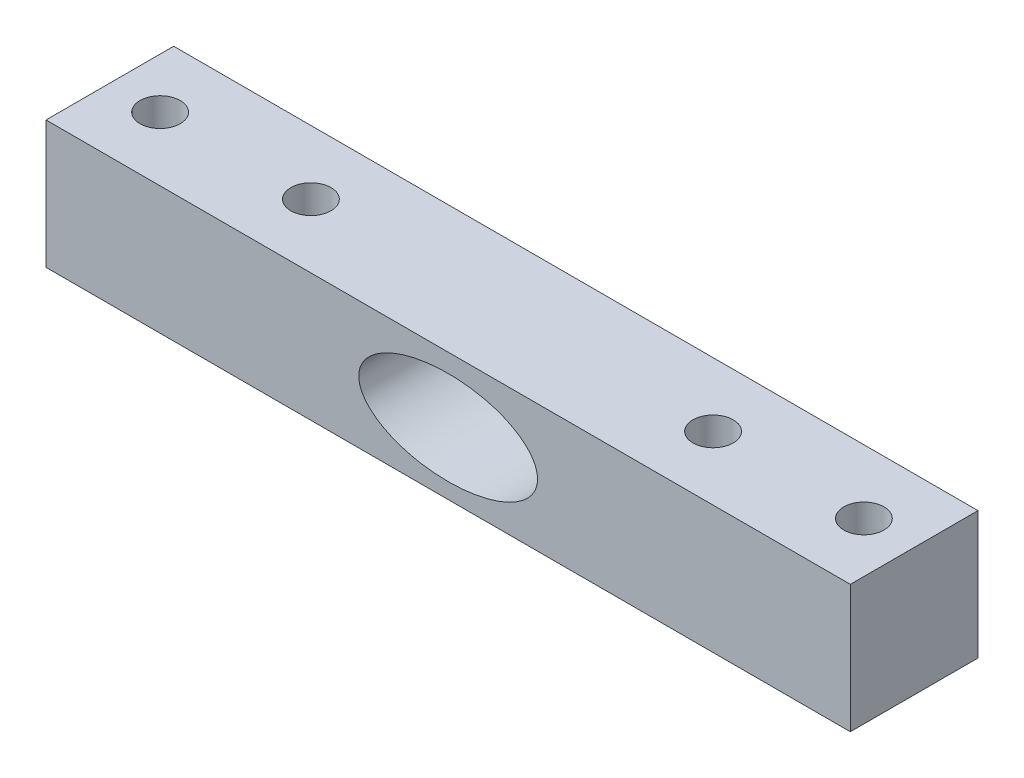
ISO-10303-21;
HEADER;
FILE_DESCRIPTION(('STEP AP214'),'2;1');
FILE_NAME('part.step','',(''),(''),'','','');
FILE_SCHEMA(('AUTOMOTIVE_DESIGN { 1 0 10303 214 1 1 1 1 }'));
ENDSEC;
DATA;
#1=APPLICATION_CONTEXT('core data for automotive mechanical design processes');
#2=APPLICATION_PROTOCOL_DEFINITION('international standard','automotive_design',2000,#1);
#3=PRODUCT_CONTEXT('',#1,'mechanical');
#4=PRODUCT('Part','Part','',(#3));
#5=PRODUCT_RELATED_PRODUCT_CATEGORY('part','',(#4));
#6=PRODUCT_DEFINITION_FORMATION('','',#4);
#7=PRODUCT_DEFINITION_CONTEXT('part definition',#1,'design');
#8=PRODUCT_DEFINITION('design','',#6,#7);
#9=PRODUCT_DEFINITION_SHAPE('','',#8);
#10=(LENGTH_UNIT() NAMED_UNIT(*) SI_UNIT(.MILLI.,.METRE.));
#11=(NAMED_UNIT(*) PLANE_ANGLE_UNIT() SI_UNIT($,.RADIAN.));
#12=(NAMED_UNIT(*) SI_UNIT($,.STERADIAN.) SOLID_ANGLE_UNIT());
#13=UNCERTAINTY_MEASURE_WITH_UNIT(LENGTH_MEASURE(1.E-05),#10,'distance_accuracy_value','');
#14=(GEOMETRIC_REPRESENTATION_CONTEXT(3) GLOBAL_UNCERTAINTY_ASSIGNED_CONTEXT((#13)) GLOBAL_UNIT_ASSIGNED_CONTEXT((#10,
#11,#12)) REPRESENTATION_CONTEXT('',''));
#15=CARTESIAN_POINT('',(0.,0.,0.));
#16=DIRECTION('',(0.,0.,1.));
#17=DIRECTION('',(1.,0.,0.));
#18=AXIS2_PLACEMENT_3D('',#15,#16,#17);
#19=CARTESIAN_POINT('',(-40.,12.7,6.35000000000001));
#20=DIRECTION('',(1.,0.,0.));
#21=DIRECTION('',(0.,0.,-1.));
#22=AXIS2_PLACEMENT_3D('',#19,#20,#21);
#23=PLANE('',#22);
#24=DIRECTION('',(0.,0.,1.));
#25=VECTOR('',#24,1.);
#26=CARTESIAN_POINT('',(-40.,0.,6.35000000000001));
#27=LINE('',#26,#25);
#28=CARTESIAN_POINT('',(-40.,0.,-6.34999999999999));
#29=VERTEX_POINT('',#28);
#30=CARTESIAN_POINT('',(-40.,0.,6.35000000000001));
#31=VERTEX_POINT('',#30);
#32=EDGE_CURVE('E110',#29,#31,#27,.T.);
#33=ORIENTED_EDGE('',*,*,#32,.T.);
#34=DIRECTION('',(0.,-1.,0.));
#35=VECTOR('',#34,1.);
#36=CARTESIAN_POINT('',(-40.,12.7,6.35000000000001));
#37=LINE('',#36,#35);
#38=CARTESIAN_POINT('',(-40.,12.7,6.35000000000001));
#39=VERTEX_POINT('',#38);
#40=EDGE_CURVE('E11',#39,#31,#37,.T.);
#41=ORIENTED_EDGE('',*,*,#40,.F.);
#42=DIRECTION('',(0.,0.,1.));
#43=VECTOR('',#42,1.);
#44=CARTESIAN_POINT('',(-40.,12.7,6.35000000000001));
#45=LINE('',#44,#43);
#46=CARTESIAN_POINT('',(-40.,12.7,-6.34999999999999));
#47=VERTEX_POINT('',#46);
#48=EDGE_CURVE('E94',#47,#39,#45,.T.);
#49=ORIENTED_EDGE('',*,*,#48,.F.);
#50=DIRECTION('',(0.,-1.,0.));
#51=VECTOR('',#50,1.);
#52=CARTESIAN_POINT('',(-40.,12.7,-6.34999999999999));
#53=LINE('',#52,#51);
#54=EDGE_CURVE('E106',#47,#29,#53,.T.);
#55=ORIENTED_EDGE('',*,*,#54,.T.);
#56=EDGE_LOOP('',(#33,#41,#49,#55));
#57=FACE_BOUND('',#56,.T.);
#58=ADVANCED_FACE('F42',(#57),#23,.F.);
#59=CARTESIAN_POINT('',(40.,12.7,6.35));
#60=DIRECTION('',(0.,0.,-1.));
#61=DIRECTION('',(-1.,0.,0.));
#62=AXIS2_PLACEMENT_3D('',#59,#60,#61);
#63=PLANE('',#62);
#64=CARTESIAN_POINT('',(0.,6.20775407012284,6.35));
#65=DIRECTION('',(0.,0.,1.));
#66=DIRECTION('',(1.,0.,0.));
#67=AXIS2_PLACEMENT_3D('',#64,#65,#66);
#68=ELLIPSE('',#67,8.89,4.6609);
#69=CARTESIAN_POINT('',(8.89,6.20775407012284,6.35));
#70=VERTEX_POINT('',#69);
#71=EDGE_CURVE('E163',#70,#70,#68,.T.);
#72=ORIENTED_EDGE('',*,*,#71,.F.);
#73=EDGE_LOOP('',(#72));
#74=FACE_BOUND('',#73,.T.);
#75=DIRECTION('',(1.,0.,0.));
#76=VECTOR('',#75,1.);
#77=CARTESIAN_POINT('',(40.,0.,6.35));
#78=LINE('',#77,#76);
#79=CARTESIAN_POINT('',(40.,0.,6.35));
#80=VERTEX_POINT('',#79);
#81=EDGE_CURVE('E99',#31,#80,#78,.T.);
#82=ORIENTED_EDGE('',*,*,#81,.T.);
#83=DIRECTION('',(0.,-1.,0.));
#84=VECTOR('',#83,1.);
#85=CARTESIAN_POINT('',(40.,12.7,6.35));
#86=LINE('',#85,#84);
#87=CARTESIAN_POINT('',(40.,12.7,6.35));
#88=VERTEX_POINT('',#87);
#89=EDGE_CURVE('E51',#88,#80,#86,.T.);
#90=ORIENTED_EDGE('',*,*,#89,.F.);
#91=DIRECTION('',(1.,0.,0.));
#92=VECTOR('',#91,1.);
#93=CARTESIAN_POINT('',(40.,12.7,6.35));
#94=LINE('',#93,#92);
#95=EDGE_CURVE('E89',#39,#88,#94,.T.);
#96=ORIENTED_EDGE('',*,*,#95,.F.);
#97=ORIENTED_EDGE('',*,*,#40,.T.);
#98=EDGE_LOOP('',(#82,#90,#96,#97));
#99=FACE_BOUND('',#98,.T.);
#100=ADVANCED_FACE('F98',(#74,#99),#63,.F.);
#101=CARTESIAN_POINT('',(40.,12.7,6.35));
#102=DIRECTION('',(-1.,0.,0.));
#103=DIRECTION('',(0.,0.,1.));
#104=AXIS2_PLACEMENT_3D('',#101,#102,#103);
#105=PLANE('',#104);
#106=DIRECTION('',(0.,0.,-1.));
#107=VECTOR('',#106,1.);
#108=CARTESIAN_POINT('',(40.,0.,6.35));
#109=LINE('',#108,#107);
#110=CARTESIAN_POINT('',(40.,0.,-6.35));
#111=VERTEX_POINT('',#110);
#112=EDGE_CURVE('E76',#80,#111,#109,.T.);
#113=ORIENTED_EDGE('',*,*,#112,.T.);
#114=DIRECTION('',(0.,-1.,0.));
#115=VECTOR('',#114,1.);
#116=CARTESIAN_POINT('',(40.,12.7,-6.35));
#117=LINE('',#116,#115);
#118=CARTESIAN_POINT('',(40.,12.7,-6.35));
#119=VERTEX_POINT('',#118);
#120=EDGE_CURVE('E101',#119,#111,#117,.T.);
#121=ORIENTED_EDGE('',*,*,#120,.F.);
#122=DIRECTION('',(0.,0.,-1.));
#123=VECTOR('',#122,1.);
#124=CARTESIAN_POINT('',(40.,12.7,6.35));
#125=LINE('',#124,#123);
#126=EDGE_CURVE('E92',#88,#119,#125,.T.);
#127=ORIENTED_EDGE('',*,*,#126,.F.);
#128=ORIENTED_EDGE('',*,*,#89,.T.);
#129=EDGE_LOOP('',(#113,#121,#127,#128));
#130=FACE_BOUND('',#129,.T.);
#131=ADVANCED_FACE('F102',(#130),#105,.F.);
#132=CARTESIAN_POINT('',(40.,12.7,-6.35));
#133=DIRECTION('',(0.,0.,1.));
#134=DIRECTION('',(1.,0.,0.));
#135=AXIS2_PLACEMENT_3D('',#132,#133,#134);
#136=PLANE('',#135);
#137=CARTESIAN_POINT('',(0.,6.20775407012284,-6.35));
#138=DIRECTION('',(0.,0.,1.));
#139=DIRECTION('',(1.,0.,0.));
#140=AXIS2_PLACEMENT_3D('',#137,#138,#139);
#141=ELLIPSE('',#140,8.89,4.6609);
#142=CARTESIAN_POINT('',(8.89,6.20775407012284,-6.35));
#143=VERTEX_POINT('',#142);
#144=EDGE_CURVE('E153',#143,#143,#141,.T.);
#145=ORIENTED_EDGE('',*,*,#144,.T.);
#146=EDGE_LOOP('',(#145));
#147=FACE_BOUND('',#146,.T.);
#148=DIRECTION('',(-1.,0.,0.));
#149=VECTOR('',#148,1.);
#150=CARTESIAN_POINT('',(40.,0.,-6.35));
#151=LINE('',#150,#149);
#152=EDGE_CURVE('E82',#111,#29,#151,.T.);
#153=ORIENTED_EDGE('',*,*,#152,.T.);
#154=ORIENTED_EDGE('',*,*,#54,.F.);
#155=DIRECTION('',(-1.,0.,0.));
#156=VECTOR('',#155,1.);
#157=CARTESIAN_POINT('',(40.,12.7,-6.35));
#158=LINE('',#157,#156);
#159=EDGE_CURVE('E59',#119,#47,#158,.T.);
#160=ORIENTED_EDGE('',*,*,#159,.F.);
#161=ORIENTED_EDGE('',*,*,#120,.T.);
#162=EDGE_LOOP('',(#153,#154,#160,#161));
#163=FACE_BOUND('',#162,.T.);
#164=ADVANCED_FACE('F124',(#147,#163),#136,.F.);
#165=CARTESIAN_POINT('',(0.,12.7,0.));
#166=DIRECTION('',(0.,1.,0.));
#167=DIRECTION('',(0.,0.,1.));
#168=AXIS2_PLACEMENT_3D('',#165,#166,#167);
#169=PLANE('',#168);
#170=CARTESIAN_POINT('',(-35.,12.7,0.));
#171=DIRECTION('',(0.,1.,0.));
#172=DIRECTION('',(0.,0.,1.));
#173=AXIS2_PLACEMENT_3D('',#170,#171,#172);
#174=CIRCLE('',#173,2.);
#175=CARTESIAN_POINT('',(-35.,12.7,2.));
#176=VERTEX_POINT('',#175);
#177=EDGE_CURVE('E148',#176,#176,#174,.T.);
#178=ORIENTED_EDGE('',*,*,#177,.F.);
#179=EDGE_LOOP('',(#178));
#180=FACE_BOUND('',#179,.T.);
#181=CARTESIAN_POINT('',(20.,12.7,0.));
#182=DIRECTION('',(0.,1.,0.));
#183=DIRECTION('',(0.,0.,1.));
#184=AXIS2_PLACEMENT_3D('',#181,#182,#183);
#185=CIRCLE('',#184,2.);
#186=CARTESIAN_POINT('',(20.,12.7,2.));
#187=VERTEX_POINT('',#186);
#188=EDGE_CURVE('E136',#187,#187,#185,.T.);
#189=ORIENTED_EDGE('',*,*,#188,.F.);
#190=EDGE_LOOP('',(#189));
#191=FACE_BOUND('',#190,.T.);
#192=CARTESIAN_POINT('',(35.,12.7,0.));
#193=DIRECTION('',(0.,1.,0.));
#194=DIRECTION('',(0.,0.,1.));
#195=AXIS2_PLACEMENT_3D('',#192,#193,#194);
#196=CIRCLE('',#195,2.);
#197=CARTESIAN_POINT('',(35.,12.7,2.));
#198=VERTEX_POINT('',#197);
#199=EDGE_CURVE('E135',#198,#198,#196,.T.);
#200=ORIENTED_EDGE('',*,*,#199,.F.);
#201=EDGE_LOOP('',(#200));
#202=FACE_BOUND('',#201,.T.);
#203=CARTESIAN_POINT('',(-20.,12.7,0.));
#204=DIRECTION('',(0.,1.,0.));
#205=DIRECTION('',(0.,0.,1.));
#206=AXIS2_PLACEMENT_3D('',#203,#204,#205);
#207=CIRCLE('',#206,2.);
#208=CARTESIAN_POINT('',(-20.,12.7,2.));
#209=VERTEX_POINT('',#208);
#210=EDGE_CURVE('E144',#209,#209,#207,.T.);
#211=ORIENTED_EDGE('',*,*,#210,.F.);
#212=EDGE_LOOP('',(#211));
#213=FACE_BOUND('',#212,.T.);
#214=ORIENTED_EDGE('',*,*,#48,.T.);
#215=ORIENTED_EDGE('',*,*,#95,.T.);
#216=ORIENTED_EDGE('',*,*,#126,.T.);
#217=ORIENTED_EDGE('',*,*,#159,.T.);
#218=EDGE_LOOP('',(#214,#215,#216,#217));
#219=FACE_BOUND('',#218,.T.);
#220=ADVANCED_FACE('F90',(#180,#191,#202,#213,#219),#169,.T.);
#221=CARTESIAN_POINT('',(0.,0.,0.));
#222=DIRECTION('',(0.,1.,0.));
#223=DIRECTION('',(0.,0.,1.));
#224=AXIS2_PLACEMENT_3D('',#221,#222,#223);
#225=PLANE('',#224);
#226=CARTESIAN_POINT('',(-35.,0.,0.));
#227=DIRECTION('',(0.,1.,0.));
#228=DIRECTION('',(0.,0.,1.));
#229=AXIS2_PLACEMENT_3D('',#226,#227,#228);
#230=CIRCLE('',#229,2.);
#231=CARTESIAN_POINT('',(-35.,0.,2.));
#232=VERTEX_POINT('',#231);
#233=EDGE_CURVE('E114',#232,#232,#230,.T.);
#234=ORIENTED_EDGE('',*,*,#233,.T.);
#235=EDGE_LOOP('',(#234));
#236=FACE_BOUND('',#235,.T.);
#237=CARTESIAN_POINT('',(20.,0.,0.));
#238=DIRECTION('',(0.,1.,0.));
#239=DIRECTION('',(0.,0.,1.));
#240=AXIS2_PLACEMENT_3D('',#237,#238,#239);
#241=CIRCLE('',#240,2.);
#242=CARTESIAN_POINT('',(20.,0.,2.));
#243=VERTEX_POINT('',#242);
#244=EDGE_CURVE('E149',#243,#243,#241,.T.);
#245=ORIENTED_EDGE('',*,*,#244,.T.);
#246=EDGE_LOOP('',(#245));
#247=FACE_BOUND('',#246,.T.);
#248=CARTESIAN_POINT('',(35.,0.,0.));
#249=DIRECTION('',(0.,1.,0.));
#250=DIRECTION('',(0.,0.,1.));
#251=AXIS2_PLACEMENT_3D('',#248,#249,#250);
#252=CIRCLE('',#251,2.);
#253=CARTESIAN_POINT('',(35.,0.,2.));
#254=VERTEX_POINT('',#253);
#255=EDGE_CURVE('E131',#254,#254,#252,.T.);
#256=ORIENTED_EDGE('',*,*,#255,.T.);
#257=EDGE_LOOP('',(#256));
#258=FACE_BOUND('',#257,.T.);
#259=CARTESIAN_POINT('',(-20.,0.,0.));
#260=DIRECTION('',(0.,1.,0.));
#261=DIRECTION('',(0.,0.,1.));
#262=AXIS2_PLACEMENT_3D('',#259,#260,#261);
#263=CIRCLE('',#262,2.);
#264=CARTESIAN_POINT('',(-20.,0.,2.));
#265=VERTEX_POINT('',#264);
#266=EDGE_CURVE('E140',#265,#265,#263,.T.);
#267=ORIENTED_EDGE('',*,*,#266,.T.);
#268=EDGE_LOOP('',(#267));
#269=FACE_BOUND('',#268,.T.);
#270=ORIENTED_EDGE('',*,*,#32,.F.);
#271=ORIENTED_EDGE('',*,*,#152,.F.);
#272=ORIENTED_EDGE('',*,*,#112,.F.);
#273=ORIENTED_EDGE('',*,*,#81,.F.);
#274=EDGE_LOOP('',(#270,#271,#272,#273));
#275=FACE_BOUND('',#274,.T.);
#276=ADVANCED_FACE('F127',(#236,#247,#258,#269,#275),#225,.F.);
#277=CARTESIAN_POINT('',(-20.,0.,0.));
#278=DIRECTION('',(0.,1.,0.));
#279=DIRECTION('',(0.,0.,1.));
#280=AXIS2_PLACEMENT_3D('',#277,#278,#279);
#281=CYLINDRICAL_SURFACE('',#280,2.);
#282=ORIENTED_EDGE('',*,*,#266,.F.);
#283=EDGE_LOOP('',(#282));
#284=FACE_BOUND('',#283,.T.);
#285=ORIENTED_EDGE('',*,*,#210,.T.);
#286=EDGE_LOOP('',(#285));
#287=FACE_BOUND('',#286,.T.);
#288=ADVANCED_FACE('F184',(#284,#287),#281,.F.);
#289=CARTESIAN_POINT('',(35.,0.,0.));
#290=DIRECTION('',(0.,1.,0.));
#291=DIRECTION('',(0.,0.,1.));
#292=AXIS2_PLACEMENT_3D('',#289,#290,#291);
#293=CYLINDRICAL_SURFACE('',#292,2.);
#294=ORIENTED_EDGE('',*,*,#255,.F.);
#295=EDGE_LOOP('',(#294));
#296=FACE_BOUND('',#295,.T.);
#297=ORIENTED_EDGE('',*,*,#199,.T.);
#298=EDGE_LOOP('',(#297));
#299=FACE_BOUND('',#298,.T.);
#300=ADVANCED_FACE('F182',(#296,#299),#293,.F.);
#301=CARTESIAN_POINT('',(20.,0.,0.));
#302=DIRECTION('',(0.,1.,0.));
#303=DIRECTION('',(0.,0.,1.));
#304=AXIS2_PLACEMENT_3D('',#301,#302,#303);
#305=CYLINDRICAL_SURFACE('',#304,2.);
#306=ORIENTED_EDGE('',*,*,#244,.F.);
#307=EDGE_LOOP('',(#306));
#308=FACE_BOUND('',#307,.T.);
#309=ORIENTED_EDGE('',*,*,#188,.T.);
#310=EDGE_LOOP('',(#309));
#311=FACE_BOUND('',#310,.T.);
#312=ADVANCED_FACE('F178',(#308,#311),#305,.F.);
#313=CARTESIAN_POINT('',(-35.,0.,0.));
#314=DIRECTION('',(0.,1.,0.));
#315=DIRECTION('',(0.,0.,1.));
#316=AXIS2_PLACEMENT_3D('',#313,#314,#315);
#317=CYLINDRICAL_SURFACE('',#316,2.);
#318=ORIENTED_EDGE('',*,*,#233,.F.);
#319=EDGE_LOOP('',(#318));
#320=FACE_BOUND('',#319,.T.);
#321=ORIENTED_EDGE('',*,*,#177,.T.);
#322=EDGE_LOOP('',(#321));
#323=FACE_BOUND('',#322,.T.);
#324=ADVANCED_FACE('F174',(#320,#323),#317,.F.);
#325=DIRECTION('',(0.,0.,1.));
#326=VECTOR('',#325,1.);
#327=SURFACE_OF_LINEAR_EXTRUSION('',#141,#326);
#328=ORIENTED_EDGE('',*,*,#144,.F.);
#329=EDGE_LOOP('',(#328));
#330=FACE_BOUND('',#329,.T.);
#331=ORIENTED_EDGE('',*,*,#71,.T.);
#332=EDGE_LOOP('',(#331));
#333=FACE_BOUND('',#332,.T.);
#334=ADVANCED_FACE('F171',(#330,#333),#327,.F.);
#335=CLOSED_SHELL('',(#58,#100,#131,#164,#220,#276,#288,#300,#312,#324,#334));
#336=MANIFOLD_SOLID_BREP('B2',#335);
#337=ADVANCED_BREP_SHAPE_REPRESENTATION('',(#18,#336),#14);
#338=SHAPE_DEFINITION_REPRESENTATION(#9,#337);
ENDSEC;
END-ISO-10303-21;
